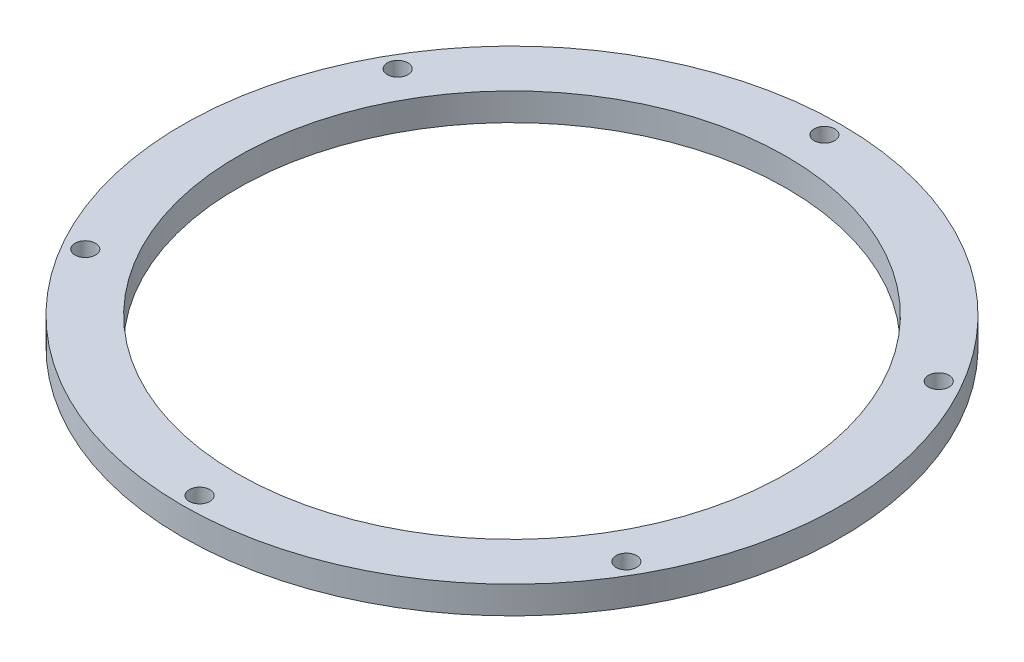
ISO-10303-21;
HEADER;
FILE_DESCRIPTION(('STEP AP214'),'2;1');
FILE_NAME('part.step','',(''),(''),'','','');
FILE_SCHEMA(('AUTOMOTIVE_DESIGN { 1 0 10303 214 1 1 1 1 }'));
ENDSEC;
DATA;
#1=APPLICATION_CONTEXT('core data for automotive mechanical design processes');
#2=APPLICATION_PROTOCOL_DEFINITION('international standard','automotive_design',2000,#1);
#3=PRODUCT_CONTEXT('',#1,'mechanical');
#4=PRODUCT('Part','Part','',(#3));
#5=PRODUCT_RELATED_PRODUCT_CATEGORY('part','',(#4));
#6=PRODUCT_DEFINITION_FORMATION('','',#4);
#7=PRODUCT_DEFINITION_CONTEXT('part definition',#1,'design');
#8=PRODUCT_DEFINITION('design','',#6,#7);
#9=PRODUCT_DEFINITION_SHAPE('','',#8);
#10=(LENGTH_UNIT() NAMED_UNIT(*) SI_UNIT(.MILLI.,.METRE.));
#11=(NAMED_UNIT(*) PLANE_ANGLE_UNIT() SI_UNIT($,.RADIAN.));
#12=(NAMED_UNIT(*) SI_UNIT($,.STERADIAN.) SOLID_ANGLE_UNIT());
#13=UNCERTAINTY_MEASURE_WITH_UNIT(LENGTH_MEASURE(1.E-05),#10,'distance_accuracy_value','');
#14=(GEOMETRIC_REPRESENTATION_CONTEXT(3) GLOBAL_UNCERTAINTY_ASSIGNED_CONTEXT((#13)) GLOBAL_UNIT_ASSIGNED_CONTEXT((#10,
#11,#12)) REPRESENTATION_CONTEXT('',''));
#15=CARTESIAN_POINT('',(0.,0.,0.));
#16=DIRECTION('',(0.,0.,1.));
#17=DIRECTION('',(1.,0.,0.));
#18=AXIS2_PLACEMENT_3D('',#15,#16,#17);
#19=CARTESIAN_POINT('',(0.,4.,0.));
#20=DIRECTION('',(0.,1.,0.));
#21=DIRECTION('',(0.,0.,1.));
#22=AXIS2_PLACEMENT_3D('',#19,#20,#21);
#23=PLANE('',#22);
#24=CARTESIAN_POINT('',(39.404155872192,4.,-22.75));
#25=DIRECTION('',(0.,1.,0.));
#26=DIRECTION('',(0.,0.,1.));
#27=AXIS2_PLACEMENT_3D('',#24,#25,#26);
#28=CIRCLE('',#27,1.5);
#29=CARTESIAN_POINT('',(39.404155872192,4.,-21.25));
#30=VERTEX_POINT('',#29);
#31=EDGE_CURVE('E77',#30,#30,#28,.T.);
#32=ORIENTED_EDGE('',*,*,#31,.F.);
#33=EDGE_LOOP('',(#32));
#34=FACE_BOUND('',#33,.T.);
#35=CARTESIAN_POINT('',(-39.404155872192,4.,-22.75));
#36=DIRECTION('',(0.,1.,0.));
#37=DIRECTION('',(0.,0.,1.));
#38=AXIS2_PLACEMENT_3D('',#35,#36,#37);
#39=CIRCLE('',#38,1.5);
#40=CARTESIAN_POINT('',(-39.404155872192,4.,-21.25));
#41=VERTEX_POINT('',#40);
#42=EDGE_CURVE('E65',#41,#41,#39,.T.);
#43=ORIENTED_EDGE('',*,*,#42,.F.);
#44=EDGE_LOOP('',(#43));
#45=FACE_BOUND('',#44,.T.);
#46=CARTESIAN_POINT('',(0.,4.,45.5));
#47=DIRECTION('',(0.,1.,0.));
#48=DIRECTION('',(0.,0.,1.));
#49=AXIS2_PLACEMENT_3D('',#46,#47,#48);
#50=CIRCLE('',#49,1.5);
#51=CARTESIAN_POINT('',(0.,4.,47.));
#52=VERTEX_POINT('',#51);
#53=EDGE_CURVE('E52',#52,#52,#50,.T.);
#54=ORIENTED_EDGE('',*,*,#53,.F.);
#55=EDGE_LOOP('',(#54));
#56=FACE_BOUND('',#55,.T.);
#57=CARTESIAN_POINT('',(0.,4.,0.));
#58=DIRECTION('',(0.,1.,0.));
#59=DIRECTION('',(0.,0.,1.));
#60=AXIS2_PLACEMENT_3D('',#57,#58,#59);
#61=CIRCLE('',#60,48.);
#62=CARTESIAN_POINT('',(0.,4.,48.));
#63=VERTEX_POINT('',#62);
#64=EDGE_CURVE('E10',#63,#63,#61,.T.);
#65=ORIENTED_EDGE('',*,*,#64,.T.);
#66=EDGE_LOOP('',(#65));
#67=FACE_BOUND('',#66,.T.);
#68=CARTESIAN_POINT('',(0.,4.,0.));
#69=DIRECTION('',(0.,1.,0.));
#70=DIRECTION('',(0.,0.,1.));
#71=AXIS2_PLACEMENT_3D('',#68,#69,#70);
#72=CIRCLE('',#71,40.);
#73=CARTESIAN_POINT('',(0.,4.,40.));
#74=VERTEX_POINT('',#73);
#75=EDGE_CURVE('E48',#74,#74,#72,.T.);
#76=ORIENTED_EDGE('',*,*,#75,.F.);
#77=EDGE_LOOP('',(#76));
#78=FACE_BOUND('',#77,.T.);
#79=CARTESIAN_POINT('',(-39.404155872192,4.,22.75));
#80=DIRECTION('',(0.,1.,0.));
#81=DIRECTION('',(0.,0.,1.));
#82=AXIS2_PLACEMENT_3D('',#79,#80,#81);
#83=CIRCLE('',#82,1.5);
#84=CARTESIAN_POINT('',(-39.404155872192,4.,24.25));
#85=VERTEX_POINT('',#84);
#86=EDGE_CURVE('E56',#85,#85,#83,.T.);
#87=ORIENTED_EDGE('',*,*,#86,.F.);
#88=EDGE_LOOP('',(#87));
#89=FACE_BOUND('',#88,.T.);
#90=CARTESIAN_POINT('',(0.,4.,-45.5));
#91=DIRECTION('',(0.,1.,0.));
#92=DIRECTION('',(0.,0.,1.));
#93=AXIS2_PLACEMENT_3D('',#90,#91,#92);
#94=CIRCLE('',#93,1.5);
#95=CARTESIAN_POINT('',(0.,4.,-44.));
#96=VERTEX_POINT('',#95);
#97=EDGE_CURVE('E72',#96,#96,#94,.T.);
#98=ORIENTED_EDGE('',*,*,#97,.F.);
#99=EDGE_LOOP('',(#98));
#100=FACE_BOUND('',#99,.T.);
#101=CARTESIAN_POINT('',(39.404155872192,4.,22.75));
#102=DIRECTION('',(0.,1.,0.));
#103=DIRECTION('',(0.,0.,1.));
#104=AXIS2_PLACEMENT_3D('',#101,#102,#103);
#105=CIRCLE('',#104,1.5);
#106=CARTESIAN_POINT('',(39.404155872192,4.,24.25));
#107=VERTEX_POINT('',#106);
#108=EDGE_CURVE('E85',#107,#107,#105,.T.);
#109=ORIENTED_EDGE('',*,*,#108,.F.);
#110=EDGE_LOOP('',(#109));
#111=FACE_BOUND('',#110,.T.);
#112=ADVANCED_FACE('F40',(#34,#45,#56,#67,#78,#89,#100,#111),#23,.T.);
#113=CARTESIAN_POINT('',(0.,0.,0.));
#114=DIRECTION('',(0.,1.,0.));
#115=DIRECTION('',(0.,0.,1.));
#116=AXIS2_PLACEMENT_3D('',#113,#114,#115);
#117=PLANE('',#116);
#118=CARTESIAN_POINT('',(0.,0.,0.));
#119=DIRECTION('',(0.,1.,0.));
#120=DIRECTION('',(0.,0.,1.));
#121=AXIS2_PLACEMENT_3D('',#118,#119,#120);
#122=CIRCLE('',#121,48.);
#123=CARTESIAN_POINT('',(0.,0.,48.));
#124=VERTEX_POINT('',#123);
#125=EDGE_CURVE('E41',#124,#124,#122,.T.);
#126=ORIENTED_EDGE('',*,*,#125,.F.);
#127=EDGE_LOOP('',(#126));
#128=FACE_BOUND('',#127,.T.);
#129=CARTESIAN_POINT('',(0.,0.,0.));
#130=DIRECTION('',(0.,1.,0.));
#131=DIRECTION('',(0.,0.,1.));
#132=AXIS2_PLACEMENT_3D('',#129,#130,#131);
#133=CIRCLE('',#132,40.);
#134=CARTESIAN_POINT('',(0.,0.,40.));
#135=VERTEX_POINT('',#134);
#136=EDGE_CURVE('E49',#135,#135,#133,.T.);
#137=ORIENTED_EDGE('',*,*,#136,.T.);
#138=EDGE_LOOP('',(#137));
#139=FACE_BOUND('',#138,.T.);
#140=CARTESIAN_POINT('',(0.,0.,45.5));
#141=DIRECTION('',(0.,1.,0.));
#142=DIRECTION('',(0.,0.,1.));
#143=AXIS2_PLACEMENT_3D('',#140,#141,#142);
#144=CIRCLE('',#143,1.5);
#145=CARTESIAN_POINT('',(0.,0.,47.));
#146=VERTEX_POINT('',#145);
#147=EDGE_CURVE('E57',#146,#146,#144,.T.);
#148=ORIENTED_EDGE('',*,*,#147,.T.);
#149=EDGE_LOOP('',(#148));
#150=FACE_BOUND('',#149,.T.);
#151=CARTESIAN_POINT('',(-39.404155872192,0.,22.75));
#152=DIRECTION('',(0.,1.,0.));
#153=DIRECTION('',(0.,0.,1.));
#154=AXIS2_PLACEMENT_3D('',#151,#152,#153);
#155=CIRCLE('',#154,1.5);
#156=CARTESIAN_POINT('',(-39.404155872192,0.,24.25));
#157=VERTEX_POINT('',#156);
#158=EDGE_CURVE('E62',#157,#157,#155,.T.);
#159=ORIENTED_EDGE('',*,*,#158,.T.);
#160=EDGE_LOOP('',(#159));
#161=FACE_BOUND('',#160,.T.);
#162=CARTESIAN_POINT('',(-39.404155872192,0.,-22.75));
#163=DIRECTION('',(0.,1.,0.));
#164=DIRECTION('',(0.,0.,1.));
#165=AXIS2_PLACEMENT_3D('',#162,#163,#164);
#166=CIRCLE('',#165,1.5);
#167=CARTESIAN_POINT('',(-39.404155872192,0.,-21.25));
#168=VERTEX_POINT('',#167);
#169=EDGE_CURVE('E70',#168,#168,#166,.T.);
#170=ORIENTED_EDGE('',*,*,#169,.T.);
#171=EDGE_LOOP('',(#170));
#172=FACE_BOUND('',#171,.T.);
#173=CARTESIAN_POINT('',(0.,0.,-45.5));
#174=DIRECTION('',(0.,1.,0.));
#175=DIRECTION('',(0.,0.,1.));
#176=AXIS2_PLACEMENT_3D('',#173,#174,#175);
#177=CIRCLE('',#176,1.5);
#178=CARTESIAN_POINT('',(0.,0.,-44.));
#179=VERTEX_POINT('',#178);
#180=EDGE_CURVE('E74',#179,#179,#177,.T.);
#181=ORIENTED_EDGE('',*,*,#180,.T.);
#182=EDGE_LOOP('',(#181));
#183=FACE_BOUND('',#182,.T.);
#184=CARTESIAN_POINT('',(39.404155872192,0.,-22.75));
#185=DIRECTION('',(0.,1.,0.));
#186=DIRECTION('',(0.,0.,1.));
#187=AXIS2_PLACEMENT_3D('',#184,#185,#186);
#188=CIRCLE('',#187,1.5);
#189=CARTESIAN_POINT('',(39.404155872192,0.,-21.25));
#190=VERTEX_POINT('',#189);
#191=EDGE_CURVE('E80',#190,#190,#188,.T.);
#192=ORIENTED_EDGE('',*,*,#191,.T.);
#193=EDGE_LOOP('',(#192));
#194=FACE_BOUND('',#193,.T.);
#195=CARTESIAN_POINT('',(39.404155872192,0.,22.75));
#196=DIRECTION('',(0.,1.,0.));
#197=DIRECTION('',(0.,0.,1.));
#198=AXIS2_PLACEMENT_3D('',#195,#196,#197);
#199=CIRCLE('',#198,1.5);
#200=CARTESIAN_POINT('',(39.404155872192,0.,24.25));
#201=VERTEX_POINT('',#200);
#202=EDGE_CURVE('E88',#201,#201,#199,.T.);
#203=ORIENTED_EDGE('',*,*,#202,.T.);
#204=EDGE_LOOP('',(#203));
#205=FACE_BOUND('',#204,.T.);
#206=ADVANCED_FACE('F96',(#128,#139,#150,#161,#172,#183,#194,#205),#117,.F.);
#207=CARTESIAN_POINT('',(0.,4.,0.));
#208=DIRECTION('',(0.,-1.,0.));
#209=DIRECTION('',(0.,0.,-1.));
#210=AXIS2_PLACEMENT_3D('',#207,#208,#209);
#211=CYLINDRICAL_SURFACE('',#210,48.);
#212=ORIENTED_EDGE('',*,*,#64,.F.);
#213=EDGE_LOOP('',(#212));
#214=FACE_BOUND('',#213,.T.);
#215=ORIENTED_EDGE('',*,*,#125,.T.);
#216=EDGE_LOOP('',(#215));
#217=FACE_BOUND('',#216,.T.);
#218=ADVANCED_FACE('F39',(#214,#217),#211,.T.);
#219=CARTESIAN_POINT('',(0.,4.,0.));
#220=DIRECTION('',(0.,-1.,0.));
#221=DIRECTION('',(0.,0.,-1.));
#222=AXIS2_PLACEMENT_3D('',#219,#220,#221);
#223=CYLINDRICAL_SURFACE('',#222,40.);
#224=ORIENTED_EDGE('',*,*,#75,.T.);
#225=EDGE_LOOP('',(#224));
#226=FACE_BOUND('',#225,.T.);
#227=ORIENTED_EDGE('',*,*,#136,.F.);
#228=EDGE_LOOP('',(#227));
#229=FACE_BOUND('',#228,.T.);
#230=ADVANCED_FACE('F106',(#226,#229),#223,.F.);
#231=CARTESIAN_POINT('',(0.,4.,45.5));
#232=DIRECTION('',(0.,-1.,0.));
#233=DIRECTION('',(0.,0.,-1.));
#234=AXIS2_PLACEMENT_3D('',#231,#232,#233);
#235=CYLINDRICAL_SURFACE('',#234,1.5);
#236=ORIENTED_EDGE('',*,*,#53,.T.);
#237=EDGE_LOOP('',(#236));
#238=FACE_BOUND('',#237,.T.);
#239=ORIENTED_EDGE('',*,*,#147,.F.);
#240=EDGE_LOOP('',(#239));
#241=FACE_BOUND('',#240,.T.);
#242=ADVANCED_FACE('F108',(#238,#241),#235,.F.);
#243=CARTESIAN_POINT('',(-39.404155872192,4.,22.75));
#244=DIRECTION('',(0.,-1.,0.));
#245=DIRECTION('',(0.,0.,-1.));
#246=AXIS2_PLACEMENT_3D('',#243,#244,#245);
#247=CYLINDRICAL_SURFACE('',#246,1.5);
#248=ORIENTED_EDGE('',*,*,#86,.T.);
#249=EDGE_LOOP('',(#248));
#250=FACE_BOUND('',#249,.T.);
#251=ORIENTED_EDGE('',*,*,#158,.F.);
#252=EDGE_LOOP('',(#251));
#253=FACE_BOUND('',#252,.T.);
#254=ADVANCED_FACE('F114',(#250,#253),#247,.F.);
#255=CARTESIAN_POINT('',(-39.404155872192,4.,-22.75));
#256=DIRECTION('',(0.,-1.,0.));
#257=DIRECTION('',(0.,0.,-1.));
#258=AXIS2_PLACEMENT_3D('',#255,#256,#257);
#259=CYLINDRICAL_SURFACE('',#258,1.5);
#260=ORIENTED_EDGE('',*,*,#42,.T.);
#261=EDGE_LOOP('',(#260));
#262=FACE_BOUND('',#261,.T.);
#263=ORIENTED_EDGE('',*,*,#169,.F.);
#264=EDGE_LOOP('',(#263));
#265=FACE_BOUND('',#264,.T.);
#266=ADVANCED_FACE('F117',(#262,#265),#259,.F.);
#267=CARTESIAN_POINT('',(0.,4.,-45.5));
#268=DIRECTION('',(0.,-1.,0.));
#269=DIRECTION('',(0.,0.,-1.));
#270=AXIS2_PLACEMENT_3D('',#267,#268,#269);
#271=CYLINDRICAL_SURFACE('',#270,1.5);
#272=ORIENTED_EDGE('',*,*,#97,.T.);
#273=EDGE_LOOP('',(#272));
#274=FACE_BOUND('',#273,.T.);
#275=ORIENTED_EDGE('',*,*,#180,.F.);
#276=EDGE_LOOP('',(#275));
#277=FACE_BOUND('',#276,.T.);
#278=ADVANCED_FACE('F122',(#274,#277),#271,.F.);
#279=CARTESIAN_POINT('',(39.404155872192,4.,-22.75));
#280=DIRECTION('',(0.,-1.,0.));
#281=DIRECTION('',(0.,0.,-1.));
#282=AXIS2_PLACEMENT_3D('',#279,#280,#281);
#283=CYLINDRICAL_SURFACE('',#282,1.5);
#284=ORIENTED_EDGE('',*,*,#31,.T.);
#285=EDGE_LOOP('',(#284));
#286=FACE_BOUND('',#285,.T.);
#287=ORIENTED_EDGE('',*,*,#191,.F.);
#288=EDGE_LOOP('',(#287));
#289=FACE_BOUND('',#288,.T.);
#290=ADVANCED_FACE('F123',(#286,#289),#283,.F.);
#291=CARTESIAN_POINT('',(39.404155872192,4.,22.75));
#292=DIRECTION('',(0.,-1.,0.));
#293=DIRECTION('',(0.,0.,-1.));
#294=AXIS2_PLACEMENT_3D('',#291,#292,#293);
#295=CYLINDRICAL_SURFACE('',#294,1.5);
#296=ORIENTED_EDGE('',*,*,#108,.T.);
#297=EDGE_LOOP('',(#296));
#298=FACE_BOUND('',#297,.T.);
#299=ORIENTED_EDGE('',*,*,#202,.F.);
#300=EDGE_LOOP('',(#299));
#301=FACE_BOUND('',#300,.T.);
#302=ADVANCED_FACE('F95',(#298,#301),#295,.F.);
#303=CLOSED_SHELL('',(#112,#206,#218,#230,#242,#254,#266,#278,#290,#302));
#304=MANIFOLD_SOLID_BREP('B2',#303);
#305=ADVANCED_BREP_SHAPE_REPRESENTATION('',(#18,#304),#14);
#306=SHAPE_DEFINITION_REPRESENTATION(#9,#305);
ENDSEC;
END-ISO-10303-21;
